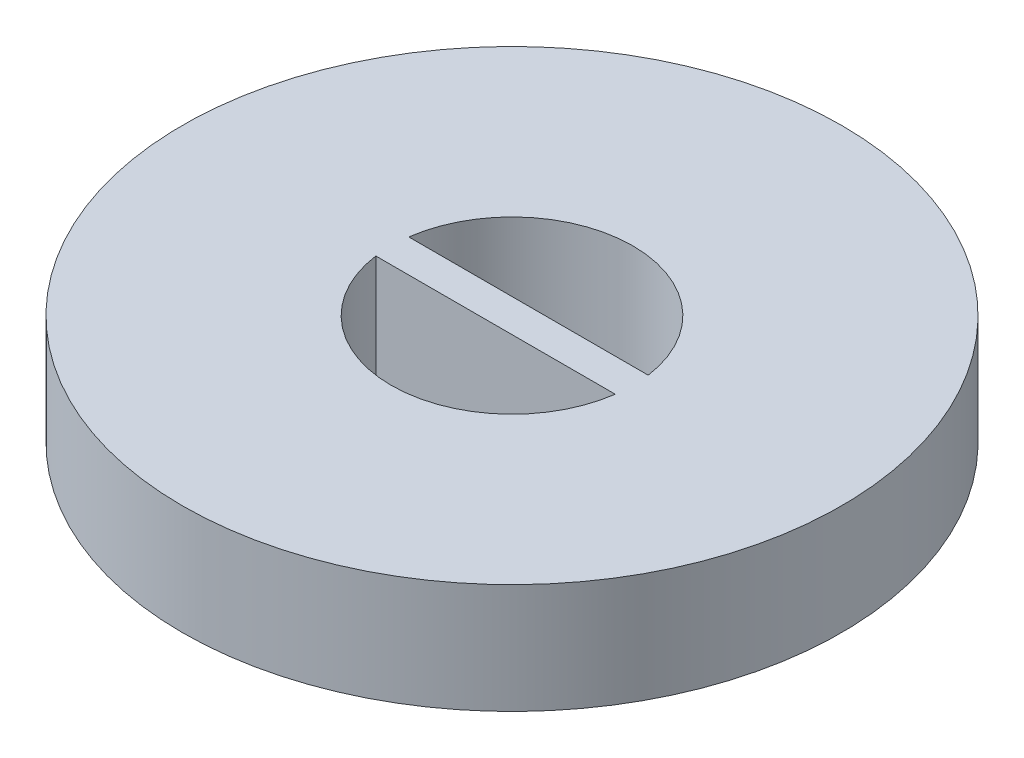
ISO-10303-21;
HEADER;
FILE_DESCRIPTION(('STEP AP214'),'2;1');
FILE_NAME('part.step','',(''),(''),'','','');
FILE_SCHEMA(('AUTOMOTIVE_DESIGN { 1 0 10303 214 1 1 1 1 }'));
ENDSEC;
DATA;
#1=APPLICATION_CONTEXT('core data for automotive mechanical design processes');
#2=APPLICATION_PROTOCOL_DEFINITION('international standard','automotive_design',2000,#1);
#3=PRODUCT_CONTEXT('',#1,'mechanical');
#4=PRODUCT('Part','Part','',(#3));
#5=PRODUCT_RELATED_PRODUCT_CATEGORY('part','',(#4));
#6=PRODUCT_DEFINITION_FORMATION('','',#4);
#7=PRODUCT_DEFINITION_CONTEXT('part definition',#1,'design');
#8=PRODUCT_DEFINITION('design','',#6,#7);
#9=PRODUCT_DEFINITION_SHAPE('','',#8);
#10=(LENGTH_UNIT() NAMED_UNIT(*) SI_UNIT(.MILLI.,.METRE.));
#11=(NAMED_UNIT(*) PLANE_ANGLE_UNIT() SI_UNIT($,.RADIAN.));
#12=(NAMED_UNIT(*) SI_UNIT($,.STERADIAN.) SOLID_ANGLE_UNIT());
#13=UNCERTAINTY_MEASURE_WITH_UNIT(LENGTH_MEASURE(1.E-05),#10,'distance_accuracy_value','');
#14=(GEOMETRIC_REPRESENTATION_CONTEXT(3) GLOBAL_UNCERTAINTY_ASSIGNED_CONTEXT((#13)) GLOBAL_UNIT_ASSIGNED_CONTEXT((#10,
#11,#12)) REPRESENTATION_CONTEXT('',''));
#15=CARTESIAN_POINT('',(0.,0.,0.));
#16=DIRECTION('',(0.,0.,1.));
#17=DIRECTION('',(1.,0.,0.));
#18=AXIS2_PLACEMENT_3D('',#15,#16,#17);
#19=CARTESIAN_POINT('',(0.,2.,0.));
#20=DIRECTION('',(0.,1.,0.));
#21=DIRECTION('',(0.,0.,1.));
#22=AXIS2_PLACEMENT_3D('',#19,#20,#21);
#23=PLANE('',#22);
#24=DIRECTION('',(1.,0.,0.));
#25=VECTOR('',#24,1.);
#26=CARTESIAN_POINT('',(0.,2.,-0.3));
#27=LINE('',#26,#25);
#28=CARTESIAN_POINT('',(-2.17944947177034,2.,-0.3));
#29=VERTEX_POINT('',#28);
#30=CARTESIAN_POINT('',(2.17944947177034,2.,-0.3));
#31=VERTEX_POINT('',#30);
#32=EDGE_CURVE('E54',#29,#31,#27,.T.);
#33=ORIENTED_EDGE('',*,*,#32,.F.);
#34=CARTESIAN_POINT('',(0.,2.,0.));
#35=DIRECTION('',(0.,1.,0.));
#36=DIRECTION('',(0.,0.,1.));
#37=AXIS2_PLACEMENT_3D('',#34,#35,#36);
#38=CIRCLE('',#37,2.2);
#39=EDGE_CURVE('E89',#31,#29,#38,.T.);
#40=ORIENTED_EDGE('',*,*,#39,.F.);
#41=EDGE_LOOP('',(#33,#40));
#42=FACE_BOUND('',#41,.T.);
#43=CARTESIAN_POINT('',(0.,2.,0.));
#44=DIRECTION('',(0.,1.,0.));
#45=DIRECTION('',(0.,0.,1.));
#46=AXIS2_PLACEMENT_3D('',#43,#44,#45);
#47=CIRCLE('',#46,6.);
#48=CARTESIAN_POINT('',(0.,2.,6.));
#49=VERTEX_POINT('',#48);
#50=EDGE_CURVE('E105',#49,#49,#47,.T.);
#51=ORIENTED_EDGE('',*,*,#50,.T.);
#52=EDGE_LOOP('',(#51));
#53=FACE_BOUND('',#52,.T.);
#54=CARTESIAN_POINT('',(0.,2.,0.));
#55=DIRECTION('',(0.,1.,0.));
#56=DIRECTION('',(0.,0.,1.));
#57=AXIS2_PLACEMENT_3D('',#54,#55,#56);
#58=CIRCLE('',#57,2.2);
#59=CARTESIAN_POINT('',(-2.17944947177034,2.,0.3));
#60=VERTEX_POINT('',#59);
#61=CARTESIAN_POINT('',(2.17944947177034,2.,0.3));
#62=VERTEX_POINT('',#61);
#63=EDGE_CURVE('E101',#60,#62,#58,.T.);
#64=ORIENTED_EDGE('',*,*,#63,.F.);
#65=DIRECTION('',(1.,0.,0.));
#66=VECTOR('',#65,1.);
#67=CARTESIAN_POINT('',(0.,2.,0.3));
#68=LINE('',#67,#66);
#69=EDGE_CURVE('E62',#60,#62,#68,.T.);
#70=ORIENTED_EDGE('',*,*,#69,.T.);
#71=EDGE_LOOP('',(#64,#70));
#72=FACE_BOUND('',#71,.T.);
#73=ADVANCED_FACE('F39',(#42,#53,#72),#23,.T.);
#74=CARTESIAN_POINT('',(0.,0.,0.));
#75=DIRECTION('',(0.,1.,0.));
#76=DIRECTION('',(0.,0.,1.));
#77=AXIS2_PLACEMENT_3D('',#74,#75,#76);
#78=PLANE('',#77);
#79=CARTESIAN_POINT('',(0.,0.,0.));
#80=DIRECTION('',(0.,1.,0.));
#81=DIRECTION('',(0.,0.,1.));
#82=AXIS2_PLACEMENT_3D('',#79,#80,#81);
#83=CIRCLE('',#82,2.2);
#84=CARTESIAN_POINT('',(2.17944947177034,0.,-0.3));
#85=VERTEX_POINT('',#84);
#86=CARTESIAN_POINT('',(-2.17944947177034,0.,-0.3));
#87=VERTEX_POINT('',#86);
#88=EDGE_CURVE('E47',#85,#87,#83,.T.);
#89=ORIENTED_EDGE('',*,*,#88,.T.);
#90=DIRECTION('',(1.,0.,0.));
#91=VECTOR('',#90,1.);
#92=CARTESIAN_POINT('',(0.,0.,-0.3));
#93=LINE('',#92,#91);
#94=EDGE_CURVE('E11',#87,#85,#93,.T.);
#95=ORIENTED_EDGE('',*,*,#94,.T.);
#96=EDGE_LOOP('',(#89,#95));
#97=FACE_BOUND('',#96,.T.);
#98=CARTESIAN_POINT('',(0.,0.,0.));
#99=DIRECTION('',(0.,1.,0.));
#100=DIRECTION('',(0.,0.,1.));
#101=AXIS2_PLACEMENT_3D('',#98,#99,#100);
#102=CIRCLE('',#101,6.);
#103=CARTESIAN_POINT('',(0.,0.,6.));
#104=VERTEX_POINT('',#103);
#105=EDGE_CURVE('E85',#104,#104,#102,.T.);
#106=ORIENTED_EDGE('',*,*,#105,.F.);
#107=EDGE_LOOP('',(#106));
#108=FACE_BOUND('',#107,.T.);
#109=DIRECTION('',(1.,0.,0.));
#110=VECTOR('',#109,1.);
#111=CARTESIAN_POINT('',(0.,0.,0.3));
#112=LINE('',#111,#110);
#113=CARTESIAN_POINT('',(-2.17944947177034,0.,0.3));
#114=VERTEX_POINT('',#113);
#115=CARTESIAN_POINT('',(2.17944947177034,0.,0.3));
#116=VERTEX_POINT('',#115);
#117=EDGE_CURVE('E113',#114,#116,#112,.T.);
#118=ORIENTED_EDGE('',*,*,#117,.F.);
#119=CARTESIAN_POINT('',(0.,0.,0.));
#120=DIRECTION('',(0.,1.,0.));
#121=DIRECTION('',(0.,0.,1.));
#122=AXIS2_PLACEMENT_3D('',#119,#120,#121);
#123=CIRCLE('',#122,2.2);
#124=EDGE_CURVE('E108',#114,#116,#123,.T.);
#125=ORIENTED_EDGE('',*,*,#124,.T.);
#126=EDGE_LOOP('',(#118,#125));
#127=FACE_BOUND('',#126,.T.);
#128=ADVANCED_FACE('F116',(#97,#108,#127),#78,.F.);
#129=CARTESIAN_POINT('',(0.,2.,0.));
#130=DIRECTION('',(0.,-1.,0.));
#131=DIRECTION('',(0.,0.,-1.));
#132=AXIS2_PLACEMENT_3D('',#129,#130,#131);
#133=CYLINDRICAL_SURFACE('',#132,6.);
#134=ORIENTED_EDGE('',*,*,#50,.F.);
#135=EDGE_LOOP('',(#134));
#136=FACE_BOUND('',#135,.T.);
#137=ORIENTED_EDGE('',*,*,#105,.T.);
#138=EDGE_LOOP('',(#137));
#139=FACE_BOUND('',#138,.T.);
#140=ADVANCED_FACE('F41',(#136,#139),#133,.T.);
#141=CARTESIAN_POINT('',(0.,-2.,0.3));
#142=DIRECTION('',(0.,0.,1.));
#143=DIRECTION('',(1.,0.,0.));
#144=AXIS2_PLACEMENT_3D('',#141,#142,#143);
#145=PLANE('',#144);
#146=ORIENTED_EDGE('',*,*,#117,.T.);
#147=DIRECTION('',(0.,1.,0.));
#148=VECTOR('',#147,1.);
#149=CARTESIAN_POINT('',(2.17944947177034,-2.,0.3));
#150=LINE('',#149,#148);
#151=EDGE_CURVE('E94',#116,#62,#150,.T.);
#152=ORIENTED_EDGE('',*,*,#151,.T.);
#153=ORIENTED_EDGE('',*,*,#69,.F.);
#154=DIRECTION('',(0.,1.,0.));
#155=VECTOR('',#154,1.);
#156=CARTESIAN_POINT('',(-2.17944947177034,-2.,0.3));
#157=LINE('',#156,#155);
#158=EDGE_CURVE('E96',#114,#60,#157,.T.);
#159=ORIENTED_EDGE('',*,*,#158,.F.);
#160=EDGE_LOOP('',(#146,#152,#153,#159));
#161=FACE_BOUND('',#160,.T.);
#162=ADVANCED_FACE('F122',(#161),#145,.T.);
#163=CARTESIAN_POINT('',(0.,-2.,0.));
#164=DIRECTION('',(0.,1.,0.));
#165=DIRECTION('',(0.,0.,1.));
#166=AXIS2_PLACEMENT_3D('',#163,#164,#165);
#167=CYLINDRICAL_SURFACE('',#166,2.2);
#168=ORIENTED_EDGE('',*,*,#158,.T.);
#169=ORIENTED_EDGE('',*,*,#63,.T.);
#170=ORIENTED_EDGE('',*,*,#151,.F.);
#171=ORIENTED_EDGE('',*,*,#124,.F.);
#172=EDGE_LOOP('',(#168,#169,#170,#171));
#173=FACE_BOUND('',#172,.T.);
#174=ADVANCED_FACE('F125',(#173),#167,.F.);
#175=CARTESIAN_POINT('',(0.,-2.,-0.3));
#176=DIRECTION('',(0.,0.,1.));
#177=DIRECTION('',(1.,0.,0.));
#178=AXIS2_PLACEMENT_3D('',#175,#176,#177);
#179=PLANE('',#178);
#180=DIRECTION('',(0.,1.,0.));
#181=VECTOR('',#180,1.);
#182=CARTESIAN_POINT('',(-2.17944947177034,-2.,-0.3));
#183=LINE('',#182,#181);
#184=EDGE_CURVE('E80',#87,#29,#183,.T.);
#185=ORIENTED_EDGE('',*,*,#184,.T.);
#186=ORIENTED_EDGE('',*,*,#32,.T.);
#187=DIRECTION('',(0.,1.,0.));
#188=VECTOR('',#187,1.);
#189=CARTESIAN_POINT('',(2.17944947177034,-2.,-0.3));
#190=LINE('',#189,#188);
#191=EDGE_CURVE('E86',#85,#31,#190,.T.);
#192=ORIENTED_EDGE('',*,*,#191,.F.);
#193=ORIENTED_EDGE('',*,*,#94,.F.);
#194=EDGE_LOOP('',(#185,#186,#192,#193));
#195=FACE_BOUND('',#194,.T.);
#196=ADVANCED_FACE('F82',(#195),#179,.F.);
#197=CARTESIAN_POINT('',(0.,-2.,0.));
#198=DIRECTION('',(0.,1.,0.));
#199=DIRECTION('',(0.,0.,1.));
#200=AXIS2_PLACEMENT_3D('',#197,#198,#199);
#201=CYLINDRICAL_SURFACE('',#200,2.2);
#202=ORIENTED_EDGE('',*,*,#191,.T.);
#203=ORIENTED_EDGE('',*,*,#39,.T.);
#204=ORIENTED_EDGE('',*,*,#184,.F.);
#205=ORIENTED_EDGE('',*,*,#88,.F.);
#206=EDGE_LOOP('',(#202,#203,#204,#205));
#207=FACE_BOUND('',#206,.T.);
#208=ADVANCED_FACE('F90',(#207),#201,.F.);
#209=CLOSED_SHELL('',(#73,#128,#140,#162,#174,#196,#208));
#210=MANIFOLD_SOLID_BREP('B2',#209);
#211=ADVANCED_BREP_SHAPE_REPRESENTATION('',(#18,#210),#14);
#212=SHAPE_DEFINITION_REPRESENTATION(#9,#211);
ENDSEC;
END-ISO-10303-21;
